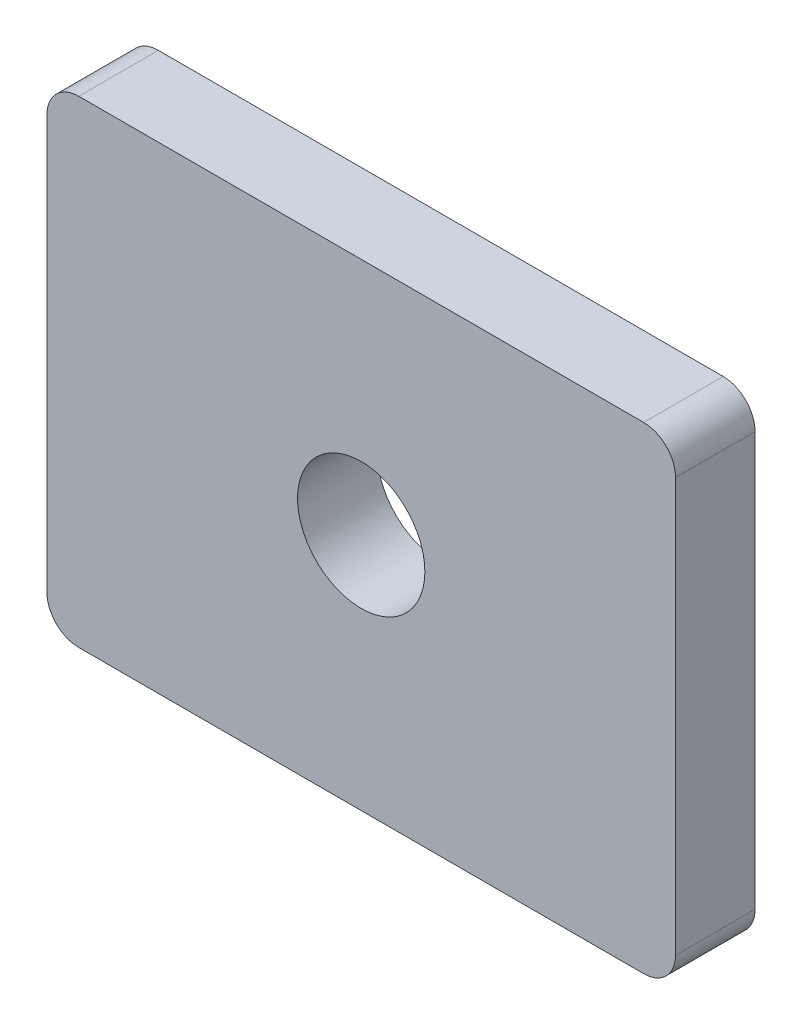
ISO-10303-21;
HEADER;
FILE_DESCRIPTION(('STEP AP214'),'2;1');
FILE_NAME('part.step','',(''),(''),'','','');
FILE_SCHEMA(('AUTOMOTIVE_DESIGN { 1 0 10303 214 1 1 1 1 }'));
ENDSEC;
DATA;
#1=APPLICATION_CONTEXT('core data for automotive mechanical design processes');
#2=APPLICATION_PROTOCOL_DEFINITION('international standard','automotive_design',2000,#1);
#3=PRODUCT_CONTEXT('',#1,'mechanical');
#4=PRODUCT('Part','Part','',(#3));
#5=PRODUCT_RELATED_PRODUCT_CATEGORY('part','',(#4));
#6=PRODUCT_DEFINITION_FORMATION('','',#4);
#7=PRODUCT_DEFINITION_CONTEXT('part definition',#1,'design');
#8=PRODUCT_DEFINITION('design','',#6,#7);
#9=PRODUCT_DEFINITION_SHAPE('','',#8);
#10=(LENGTH_UNIT() NAMED_UNIT(*) SI_UNIT(.MILLI.,.METRE.));
#11=(NAMED_UNIT(*) PLANE_ANGLE_UNIT() SI_UNIT($,.RADIAN.));
#12=(NAMED_UNIT(*) SI_UNIT($,.STERADIAN.) SOLID_ANGLE_UNIT());
#13=UNCERTAINTY_MEASURE_WITH_UNIT(LENGTH_MEASURE(1.E-05),#10,'distance_accuracy_value','');
#14=(GEOMETRIC_REPRESENTATION_CONTEXT(3) GLOBAL_UNCERTAINTY_ASSIGNED_CONTEXT((#13)) GLOBAL_UNIT_ASSIGNED_CONTEXT((#10,
#11,#12)) REPRESENTATION_CONTEXT('',''));
#15=CARTESIAN_POINT('',(0.,0.,0.));
#16=DIRECTION('',(0.,0.,1.));
#17=DIRECTION('',(1.,0.,0.));
#18=AXIS2_PLACEMENT_3D('',#15,#16,#17);
#19=CARTESIAN_POINT('',(0.,0.,5.));
#20=DIRECTION('',(0.,0.,1.));
#21=DIRECTION('',(1.,0.,0.));
#22=AXIS2_PLACEMENT_3D('',#19,#20,#21);
#23=PLANE('',#22);
#24=DIRECTION('',(0.,-1.,0.));
#25=VECTOR('',#24,1.);
#26=CARTESIAN_POINT('',(-19.75,15.,5.));
#27=LINE('',#26,#25);
#28=CARTESIAN_POINT('',(-19.75,13.,5.));
#29=VERTEX_POINT('',#28);
#30=CARTESIAN_POINT('',(-19.75,-13.,5.));
#31=VERTEX_POINT('',#30);
#32=EDGE_CURVE('E164',#29,#31,#27,.T.);
#33=ORIENTED_EDGE('',*,*,#32,.T.);
#34=CARTESIAN_POINT('',(-17.75,-13.,5.));
#35=DIRECTION('',(0.,0.,1.));
#36=DIRECTION('',(1.,0.,0.));
#37=AXIS2_PLACEMENT_3D('',#34,#35,#36);
#38=CIRCLE('',#37,2.);
#39=CARTESIAN_POINT('',(-17.75,-15.,5.));
#40=VERTEX_POINT('',#39);
#41=EDGE_CURVE('E147',#31,#40,#38,.T.);
#42=ORIENTED_EDGE('',*,*,#41,.T.);
#43=DIRECTION('',(1.,0.,0.));
#44=VECTOR('',#43,1.);
#45=CARTESIAN_POINT('',(-19.75,-15.,5.));
#46=LINE('',#45,#44);
#47=CARTESIAN_POINT('',(17.75,-15.,5.));
#48=VERTEX_POINT('',#47);
#49=EDGE_CURVE('E118',#40,#48,#46,.T.);
#50=ORIENTED_EDGE('',*,*,#49,.T.);
#51=CARTESIAN_POINT('',(17.75,-13.,5.));
#52=DIRECTION('',(0.,0.,1.));
#53=DIRECTION('',(1.,0.,0.));
#54=AXIS2_PLACEMENT_3D('',#51,#52,#53);
#55=CIRCLE('',#54,2.);
#56=CARTESIAN_POINT('',(19.75,-13.,5.));
#57=VERTEX_POINT('',#56);
#58=EDGE_CURVE('E145',#48,#57,#55,.T.);
#59=ORIENTED_EDGE('',*,*,#58,.T.);
#60=DIRECTION('',(0.,1.,0.));
#61=VECTOR('',#60,1.);
#62=CARTESIAN_POINT('',(19.75,15.,5.));
#63=LINE('',#62,#61);
#64=CARTESIAN_POINT('',(19.75,13.,5.));
#65=VERTEX_POINT('',#64);
#66=EDGE_CURVE('E125',#57,#65,#63,.T.);
#67=ORIENTED_EDGE('',*,*,#66,.T.);
#68=CARTESIAN_POINT('',(17.75,13.,5.));
#69=DIRECTION('',(0.,0.,1.));
#70=DIRECTION('',(1.,0.,0.));
#71=AXIS2_PLACEMENT_3D('',#68,#69,#70);
#72=CIRCLE('',#71,2.);
#73=CARTESIAN_POINT('',(17.75,15.,5.));
#74=VERTEX_POINT('',#73);
#75=EDGE_CURVE('E53',#65,#74,#72,.T.);
#76=ORIENTED_EDGE('',*,*,#75,.T.);
#77=DIRECTION('',(-1.,0.,0.));
#78=VECTOR('',#77,1.);
#79=CARTESIAN_POINT('',(-19.75,15.,5.));
#80=LINE('',#79,#78);
#81=CARTESIAN_POINT('',(-17.75,15.,5.));
#82=VERTEX_POINT('',#81);
#83=EDGE_CURVE('E128',#74,#82,#80,.T.);
#84=ORIENTED_EDGE('',*,*,#83,.T.);
#85=CARTESIAN_POINT('',(-17.75,13.,5.));
#86=DIRECTION('',(0.,0.,1.));
#87=DIRECTION('',(1.,0.,0.));
#88=AXIS2_PLACEMENT_3D('',#85,#86,#87);
#89=CIRCLE('',#88,2.);
#90=EDGE_CURVE('E143',#82,#29,#89,.T.);
#91=ORIENTED_EDGE('',*,*,#90,.T.);
#92=EDGE_LOOP('',(#33,#42,#50,#59,#67,#76,#84,#91));
#93=FACE_BOUND('',#92,.T.);
#94=CARTESIAN_POINT('',(0.,0.,5.));
#95=DIRECTION('',(0.,0.,1.));
#96=DIRECTION('',(1.,0.,0.));
#97=AXIS2_PLACEMENT_3D('',#94,#95,#96);
#98=CIRCLE('',#97,4.);
#99=CARTESIAN_POINT('',(4.,0.,5.));
#100=VERTEX_POINT('',#99);
#101=EDGE_CURVE('E160',#100,#100,#98,.T.);
#102=ORIENTED_EDGE('',*,*,#101,.F.);
#103=EDGE_LOOP('',(#102));
#104=FACE_BOUND('',#103,.T.);
#105=ADVANCED_FACE('F33',(#93,#104),#23,.T.);
#106=CARTESIAN_POINT('',(0.,0.,0.));
#107=DIRECTION('',(0.,0.,1.));
#108=DIRECTION('',(1.,0.,0.));
#109=AXIS2_PLACEMENT_3D('',#106,#107,#108);
#110=PLANE('',#109);
#111=DIRECTION('',(1.,0.,0.));
#112=VECTOR('',#111,1.);
#113=CARTESIAN_POINT('',(-19.75,-15.,0.));
#114=LINE('',#113,#112);
#115=CARTESIAN_POINT('',(-17.75,-15.,0.));
#116=VERTEX_POINT('',#115);
#117=CARTESIAN_POINT('',(17.75,-15.,0.));
#118=VERTEX_POINT('',#117);
#119=EDGE_CURVE('E115',#116,#118,#114,.T.);
#120=ORIENTED_EDGE('',*,*,#119,.F.);
#121=CARTESIAN_POINT('',(-17.75,-13.,0.));
#122=DIRECTION('',(0.,0.,1.));
#123=DIRECTION('',(1.,0.,0.));
#124=AXIS2_PLACEMENT_3D('',#121,#122,#123);
#125=CIRCLE('',#124,2.);
#126=CARTESIAN_POINT('',(-19.75,-13.,0.));
#127=VERTEX_POINT('',#126);
#128=EDGE_CURVE('E98',#116,#127,#125,.F.);
#129=ORIENTED_EDGE('',*,*,#128,.T.);
#130=DIRECTION('',(0.,-1.,0.));
#131=VECTOR('',#130,1.);
#132=CARTESIAN_POINT('',(-19.75,15.,0.));
#133=LINE('',#132,#131);
#134=CARTESIAN_POINT('',(-19.75,13.,0.));
#135=VERTEX_POINT('',#134);
#136=EDGE_CURVE('E126',#135,#127,#133,.T.);
#137=ORIENTED_EDGE('',*,*,#136,.F.);
#138=CARTESIAN_POINT('',(-17.75,13.,0.));
#139=DIRECTION('',(0.,0.,1.));
#140=DIRECTION('',(1.,0.,0.));
#141=AXIS2_PLACEMENT_3D('',#138,#139,#140);
#142=CIRCLE('',#141,2.);
#143=CARTESIAN_POINT('',(-17.75,15.,0.));
#144=VERTEX_POINT('',#143);
#145=EDGE_CURVE('E136',#135,#144,#142,.F.);
#146=ORIENTED_EDGE('',*,*,#145,.T.);
#147=DIRECTION('',(-1.,0.,0.));
#148=VECTOR('',#147,1.);
#149=CARTESIAN_POINT('',(-19.75,15.,0.));
#150=LINE('',#149,#148);
#151=CARTESIAN_POINT('',(17.75,15.,0.));
#152=VERTEX_POINT('',#151);
#153=EDGE_CURVE('E130',#152,#144,#150,.T.);
#154=ORIENTED_EDGE('',*,*,#153,.F.);
#155=CARTESIAN_POINT('',(17.75,13.,0.));
#156=DIRECTION('',(0.,0.,1.));
#157=DIRECTION('',(1.,0.,0.));
#158=AXIS2_PLACEMENT_3D('',#155,#156,#157);
#159=CIRCLE('',#158,2.);
#160=CARTESIAN_POINT('',(19.75,13.,0.));
#161=VERTEX_POINT('',#160);
#162=EDGE_CURVE('E119',#152,#161,#159,.F.);
#163=ORIENTED_EDGE('',*,*,#162,.T.);
#164=DIRECTION('',(0.,1.,0.));
#165=VECTOR('',#164,1.);
#166=CARTESIAN_POINT('',(19.75,15.,0.));
#167=LINE('',#166,#165);
#168=CARTESIAN_POINT('',(19.75,-13.,0.));
#169=VERTEX_POINT('',#168);
#170=EDGE_CURVE('E159',#169,#161,#167,.T.);
#171=ORIENTED_EDGE('',*,*,#170,.F.);
#172=CARTESIAN_POINT('',(17.75,-13.,0.));
#173=DIRECTION('',(0.,0.,1.));
#174=DIRECTION('',(1.,0.,0.));
#175=AXIS2_PLACEMENT_3D('',#172,#173,#174);
#176=CIRCLE('',#175,2.);
#177=EDGE_CURVE('E109',#169,#118,#176,.F.);
#178=ORIENTED_EDGE('',*,*,#177,.T.);
#179=EDGE_LOOP('',(#120,#129,#137,#146,#154,#163,#171,#178));
#180=FACE_BOUND('',#179,.T.);
#181=CARTESIAN_POINT('',(0.,0.,0.));
#182=DIRECTION('',(0.,0.,1.));
#183=DIRECTION('',(1.,0.,0.));
#184=AXIS2_PLACEMENT_3D('',#181,#182,#183);
#185=CIRCLE('',#184,4.);
#186=CARTESIAN_POINT('',(4.,0.,0.));
#187=VERTEX_POINT('',#186);
#188=EDGE_CURVE('E168',#187,#187,#185,.T.);
#189=ORIENTED_EDGE('',*,*,#188,.T.);
#190=EDGE_LOOP('',(#189));
#191=FACE_BOUND('',#190,.T.);
#192=ADVANCED_FACE('F122',(#180,#191),#110,.F.);
#193=CARTESIAN_POINT('',(19.75,15.,5.));
#194=DIRECTION('',(-1.,0.,0.));
#195=DIRECTION('',(0.,-1.,0.));
#196=AXIS2_PLACEMENT_3D('',#193,#194,#195);
#197=PLANE('',#196);
#198=ORIENTED_EDGE('',*,*,#66,.F.);
#199=DIRECTION('',(0.,0.,-1.));
#200=VECTOR('',#199,1.);
#201=CARTESIAN_POINT('',(19.75,-13.,5.));
#202=LINE('',#201,#200);
#203=EDGE_CURVE('E151',#57,#169,#202,.T.);
#204=ORIENTED_EDGE('',*,*,#203,.T.);
#205=ORIENTED_EDGE('',*,*,#170,.T.);
#206=DIRECTION('',(0.,0.,-1.));
#207=VECTOR('',#206,1.);
#208=CARTESIAN_POINT('',(19.75,13.,5.));
#209=LINE('',#208,#207);
#210=EDGE_CURVE('E149',#161,#65,#209,.F.);
#211=ORIENTED_EDGE('',*,*,#210,.T.);
#212=EDGE_LOOP('',(#198,#204,#205,#211));
#213=FACE_BOUND('',#212,.T.);
#214=ADVANCED_FACE('F182',(#213),#197,.F.);
#215=CARTESIAN_POINT('',(-19.75,15.,5.));
#216=DIRECTION('',(0.,-1.,0.));
#217=DIRECTION('',(0.,0.,-1.));
#218=AXIS2_PLACEMENT_3D('',#215,#216,#217);
#219=PLANE('',#218);
#220=ORIENTED_EDGE('',*,*,#153,.T.);
#221=DIRECTION('',(0.,0.,-1.));
#222=VECTOR('',#221,1.);
#223=CARTESIAN_POINT('',(-17.75,15.,5.));
#224=LINE('',#223,#222);
#225=EDGE_CURVE('E11',#144,#82,#224,.F.);
#226=ORIENTED_EDGE('',*,*,#225,.T.);
#227=ORIENTED_EDGE('',*,*,#83,.F.);
#228=DIRECTION('',(0.,0.,-1.));
#229=VECTOR('',#228,1.);
#230=CARTESIAN_POINT('',(17.75,15.,5.));
#231=LINE('',#230,#229);
#232=EDGE_CURVE('E41',#74,#152,#231,.T.);
#233=ORIENTED_EDGE('',*,*,#232,.T.);
#234=EDGE_LOOP('',(#220,#226,#227,#233));
#235=FACE_BOUND('',#234,.T.);
#236=ADVANCED_FACE('F156',(#235),#219,.F.);
#237=CARTESIAN_POINT('',(-19.75,15.,5.));
#238=DIRECTION('',(1.,0.,0.));
#239=DIRECTION('',(0.,1.,0.));
#240=AXIS2_PLACEMENT_3D('',#237,#238,#239);
#241=PLANE('',#240);
#242=ORIENTED_EDGE('',*,*,#136,.T.);
#243=DIRECTION('',(0.,0.,-1.));
#244=VECTOR('',#243,1.);
#245=CARTESIAN_POINT('',(-19.75,-13.,5.));
#246=LINE('',#245,#244);
#247=EDGE_CURVE('E103',#127,#31,#246,.F.);
#248=ORIENTED_EDGE('',*,*,#247,.T.);
#249=ORIENTED_EDGE('',*,*,#32,.F.);
#250=DIRECTION('',(0.,0.,-1.));
#251=VECTOR('',#250,1.);
#252=CARTESIAN_POINT('',(-19.75,13.,5.));
#253=LINE('',#252,#251);
#254=EDGE_CURVE('E108',#29,#135,#253,.T.);
#255=ORIENTED_EDGE('',*,*,#254,.T.);
#256=EDGE_LOOP('',(#242,#248,#249,#255));
#257=FACE_BOUND('',#256,.T.);
#258=ADVANCED_FACE('F188',(#257),#241,.F.);
#259=CARTESIAN_POINT('',(-19.75,-15.,5.));
#260=DIRECTION('',(0.,1.,0.));
#261=DIRECTION('',(0.,0.,1.));
#262=AXIS2_PLACEMENT_3D('',#259,#260,#261);
#263=PLANE('',#262);
#264=ORIENTED_EDGE('',*,*,#49,.F.);
#265=DIRECTION('',(0.,0.,-1.));
#266=VECTOR('',#265,1.);
#267=CARTESIAN_POINT('',(-17.75,-15.,5.));
#268=LINE('',#267,#266);
#269=EDGE_CURVE('E102',#40,#116,#268,.T.);
#270=ORIENTED_EDGE('',*,*,#269,.T.);
#271=ORIENTED_EDGE('',*,*,#119,.T.);
#272=DIRECTION('',(0.,0.,-1.));
#273=VECTOR('',#272,1.);
#274=CARTESIAN_POINT('',(17.75,-15.,5.));
#275=LINE('',#274,#273);
#276=EDGE_CURVE('E120',#118,#48,#275,.F.);
#277=ORIENTED_EDGE('',*,*,#276,.T.);
#278=EDGE_LOOP('',(#264,#270,#271,#277));
#279=FACE_BOUND('',#278,.T.);
#280=ADVANCED_FACE('F114',(#279),#263,.F.);
#281=CARTESIAN_POINT('',(0.,0.,5.));
#282=DIRECTION('',(0.,0.,-1.));
#283=DIRECTION('',(-1.,0.,0.));
#284=AXIS2_PLACEMENT_3D('',#281,#282,#283);
#285=CYLINDRICAL_SURFACE('',#284,4.);
#286=ORIENTED_EDGE('',*,*,#101,.T.);
#287=EDGE_LOOP('',(#286));
#288=FACE_BOUND('',#287,.T.);
#289=ORIENTED_EDGE('',*,*,#188,.F.);
#290=EDGE_LOOP('',(#289));
#291=FACE_BOUND('',#290,.T.);
#292=ADVANCED_FACE('F174',(#288,#291),#285,.F.);
#293=CARTESIAN_POINT('',(-17.75,-13.,5.));
#294=DIRECTION('',(0.,0.,-1.));
#295=DIRECTION('',(-1.,0.,0.));
#296=AXIS2_PLACEMENT_3D('',#293,#294,#295);
#297=CYLINDRICAL_SURFACE('',#296,2.);
#298=ORIENTED_EDGE('',*,*,#41,.F.);
#299=ORIENTED_EDGE('',*,*,#247,.F.);
#300=ORIENTED_EDGE('',*,*,#128,.F.);
#301=ORIENTED_EDGE('',*,*,#269,.F.);
#302=EDGE_LOOP('',(#298,#299,#300,#301));
#303=FACE_BOUND('',#302,.T.);
#304=ADVANCED_FACE('F101',(#303),#297,.T.);
#305=CARTESIAN_POINT('',(17.75,-13.,5.));
#306=DIRECTION('',(0.,0.,-1.));
#307=DIRECTION('',(-1.,0.,0.));
#308=AXIS2_PLACEMENT_3D('',#305,#306,#307);
#309=CYLINDRICAL_SURFACE('',#308,2.);
#310=ORIENTED_EDGE('',*,*,#58,.F.);
#311=ORIENTED_EDGE('',*,*,#276,.F.);
#312=ORIENTED_EDGE('',*,*,#177,.F.);
#313=ORIENTED_EDGE('',*,*,#203,.F.);
#314=EDGE_LOOP('',(#310,#311,#312,#313));
#315=FACE_BOUND('',#314,.T.);
#316=ADVANCED_FACE('F199',(#315),#309,.T.);
#317=CARTESIAN_POINT('',(-17.75,13.,5.));
#318=DIRECTION('',(0.,0.,-1.));
#319=DIRECTION('',(-1.,0.,0.));
#320=AXIS2_PLACEMENT_3D('',#317,#318,#319);
#321=CYLINDRICAL_SURFACE('',#320,2.);
#322=ORIENTED_EDGE('',*,*,#90,.F.);
#323=ORIENTED_EDGE('',*,*,#225,.F.);
#324=ORIENTED_EDGE('',*,*,#145,.F.);
#325=ORIENTED_EDGE('',*,*,#254,.F.);
#326=EDGE_LOOP('',(#322,#323,#324,#325));
#327=FACE_BOUND('',#326,.T.);
#328=ADVANCED_FACE('F201',(#327),#321,.T.);
#329=CARTESIAN_POINT('',(17.75,13.,5.));
#330=DIRECTION('',(0.,0.,-1.));
#331=DIRECTION('',(-1.,0.,0.));
#332=AXIS2_PLACEMENT_3D('',#329,#330,#331);
#333=CYLINDRICAL_SURFACE('',#332,2.);
#334=ORIENTED_EDGE('',*,*,#75,.F.);
#335=ORIENTED_EDGE('',*,*,#210,.F.);
#336=ORIENTED_EDGE('',*,*,#162,.F.);
#337=ORIENTED_EDGE('',*,*,#232,.F.);
#338=EDGE_LOOP('',(#334,#335,#336,#337));
#339=FACE_BOUND('',#338,.T.);
#340=ADVANCED_FACE('F35',(#339),#333,.T.);
#341=CLOSED_SHELL('',(#105,#192,#214,#236,#258,#280,#292,#304,#316,#328,#340));
#342=MANIFOLD_SOLID_BREP('B2',#341);
#343=ADVANCED_BREP_SHAPE_REPRESENTATION('',(#18,#342),#14);
#344=SHAPE_DEFINITION_REPRESENTATION(#9,#343);
ENDSEC;
END-ISO-10303-21;
